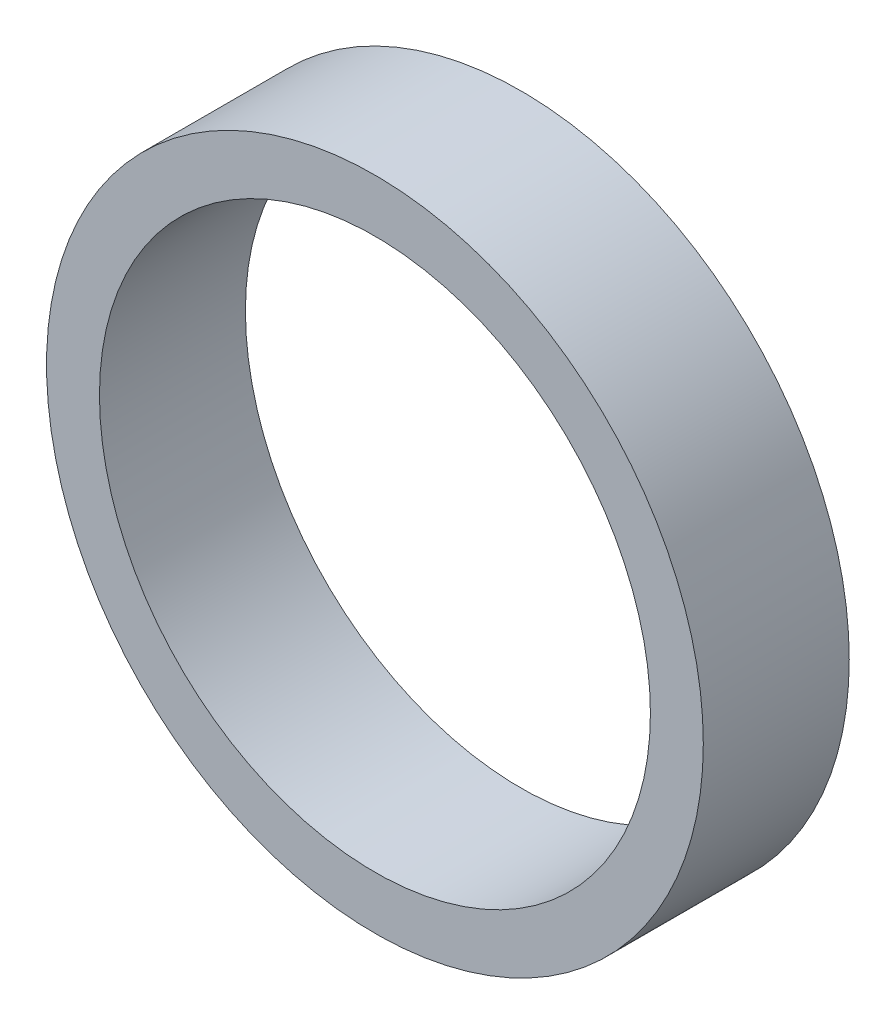
ISO-10303-21;
HEADER;
FILE_DESCRIPTION(('STEP AP214'),'2;1');
FILE_NAME('part.step','',(''),(''),'','','');
FILE_SCHEMA(('AUTOMOTIVE_DESIGN { 1 0 10303 214 1 1 1 1 }'));
ENDSEC;
DATA;
#1=APPLICATION_CONTEXT('core data for automotive mechanical design processes');
#2=APPLICATION_PROTOCOL_DEFINITION('international standard','automotive_design',2000,#1);
#3=PRODUCT_CONTEXT('',#1,'mechanical');
#4=PRODUCT('Part','Part','',(#3));
#5=PRODUCT_RELATED_PRODUCT_CATEGORY('part','',(#4));
#6=PRODUCT_DEFINITION_FORMATION('','',#4);
#7=PRODUCT_DEFINITION_CONTEXT('part definition',#1,'design');
#8=PRODUCT_DEFINITION('design','',#6,#7);
#9=PRODUCT_DEFINITION_SHAPE('','',#8);
#10=(LENGTH_UNIT() NAMED_UNIT(*) SI_UNIT(.MILLI.,.METRE.));
#11=(NAMED_UNIT(*) PLANE_ANGLE_UNIT() SI_UNIT($,.RADIAN.));
#12=(NAMED_UNIT(*) SI_UNIT($,.STERADIAN.) SOLID_ANGLE_UNIT());
#13=UNCERTAINTY_MEASURE_WITH_UNIT(LENGTH_MEASURE(1.E-05),#10,'distance_accuracy_value','');
#14=(GEOMETRIC_REPRESENTATION_CONTEXT(3) GLOBAL_UNCERTAINTY_ASSIGNED_CONTEXT((#13)) GLOBAL_UNIT_ASSIGNED_CONTEXT((#10,
#11,#12)) REPRESENTATION_CONTEXT('',''));
#15=CARTESIAN_POINT('',(0.,0.,0.));
#16=DIRECTION('',(0.,0.,1.));
#17=DIRECTION('',(1.,0.,0.));
#18=AXIS2_PLACEMENT_3D('',#15,#16,#17);
#19=CARTESIAN_POINT('',(0.,0.,4.));
#20=DIRECTION('',(0.,0.,-1.));
#21=DIRECTION('',(-1.,0.,0.));
#22=AXIS2_PLACEMENT_3D('',#19,#20,#21);
#23=CYLINDRICAL_SURFACE('',#22,9.);
#24=CARTESIAN_POINT('',(0.,0.,4.));
#25=DIRECTION('',(0.,0.,1.));
#26=DIRECTION('',(1.,0.,0.));
#27=AXIS2_PLACEMENT_3D('',#24,#25,#26);
#28=CIRCLE('',#27,9.);
#29=CARTESIAN_POINT('',(9.,0.,4.));
#30=VERTEX_POINT('',#29);
#31=EDGE_CURVE('E10',#30,#30,#28,.T.);
#32=ORIENTED_EDGE('',*,*,#31,.F.);
#33=EDGE_LOOP('',(#32));
#34=FACE_BOUND('',#33,.T.);
#35=CARTESIAN_POINT('',(0.,0.,0.));
#36=DIRECTION('',(0.,0.,1.));
#37=DIRECTION('',(1.,0.,0.));
#38=AXIS2_PLACEMENT_3D('',#35,#36,#37);
#39=CIRCLE('',#38,9.);
#40=CARTESIAN_POINT('',(9.,0.,0.));
#41=VERTEX_POINT('',#40);
#42=EDGE_CURVE('E46',#41,#41,#39,.T.);
#43=ORIENTED_EDGE('',*,*,#42,.T.);
#44=EDGE_LOOP('',(#43));
#45=FACE_BOUND('',#44,.T.);
#46=ADVANCED_FACE('F43',(#34,#45),#23,.T.);
#47=CARTESIAN_POINT('',(0.,0.,4.));
#48=DIRECTION('',(0.,0.,1.));
#49=DIRECTION('',(1.,0.,0.));
#50=AXIS2_PLACEMENT_3D('',#47,#48,#49);
#51=PLANE('',#50);
#52=CARTESIAN_POINT('',(0.,0.,4.));
#53=DIRECTION('',(0.,0.,1.));
#54=DIRECTION('',(1.,0.,0.));
#55=AXIS2_PLACEMENT_3D('',#52,#53,#54);
#56=CIRCLE('',#55,7.55);
#57=CARTESIAN_POINT('',(7.55,0.,4.));
#58=VERTEX_POINT('',#57);
#59=EDGE_CURVE('E57',#58,#58,#56,.T.);
#60=ORIENTED_EDGE('',*,*,#59,.F.);
#61=EDGE_LOOP('',(#60));
#62=FACE_BOUND('',#61,.T.);
#63=ORIENTED_EDGE('',*,*,#31,.T.);
#64=EDGE_LOOP('',(#63));
#65=FACE_BOUND('',#64,.T.);
#66=ADVANCED_FACE('F74',(#62,#65),#51,.T.);
#67=CARTESIAN_POINT('',(0.,0.,0.));
#68=DIRECTION('',(0.,0.,1.));
#69=DIRECTION('',(1.,0.,0.));
#70=AXIS2_PLACEMENT_3D('',#67,#68,#69);
#71=PLANE('',#70);
#72=CARTESIAN_POINT('',(0.,0.,0.));
#73=DIRECTION('',(0.,0.,1.));
#74=DIRECTION('',(1.,0.,0.));
#75=AXIS2_PLACEMENT_3D('',#72,#73,#74);
#76=CIRCLE('',#75,7.55);
#77=CARTESIAN_POINT('',(7.55,0.,0.));
#78=VERTEX_POINT('',#77);
#79=EDGE_CURVE('E55',#78,#78,#76,.T.);
#80=ORIENTED_EDGE('',*,*,#79,.T.);
#81=EDGE_LOOP('',(#80));
#82=FACE_BOUND('',#81,.T.);
#83=ORIENTED_EDGE('',*,*,#42,.F.);
#84=EDGE_LOOP('',(#83));
#85=FACE_BOUND('',#84,.T.);
#86=ADVANCED_FACE('F65',(#82,#85),#71,.F.);
#87=CARTESIAN_POINT('',(0.,0.,0.));
#88=DIRECTION('',(0.,0.,1.));
#89=DIRECTION('',(1.,0.,0.));
#90=AXIS2_PLACEMENT_3D('',#87,#88,#89);
#91=CYLINDRICAL_SURFACE('',#90,7.55);
#92=ORIENTED_EDGE('',*,*,#79,.F.);
#93=EDGE_LOOP('',(#92));
#94=FACE_BOUND('',#93,.T.);
#95=ORIENTED_EDGE('',*,*,#59,.T.);
#96=EDGE_LOOP('',(#95));
#97=FACE_BOUND('',#96,.T.);
#98=ADVANCED_FACE('F68',(#94,#97),#91,.F.);
#99=CLOSED_SHELL('',(#46,#66,#86,#98));
#100=MANIFOLD_SOLID_BREP('B2',#99);
#101=ADVANCED_BREP_SHAPE_REPRESENTATION('',(#18,#100),#14);
#102=SHAPE_DEFINITION_REPRESENTATION(#9,#101);
ENDSEC;
END-ISO-10303-21;
